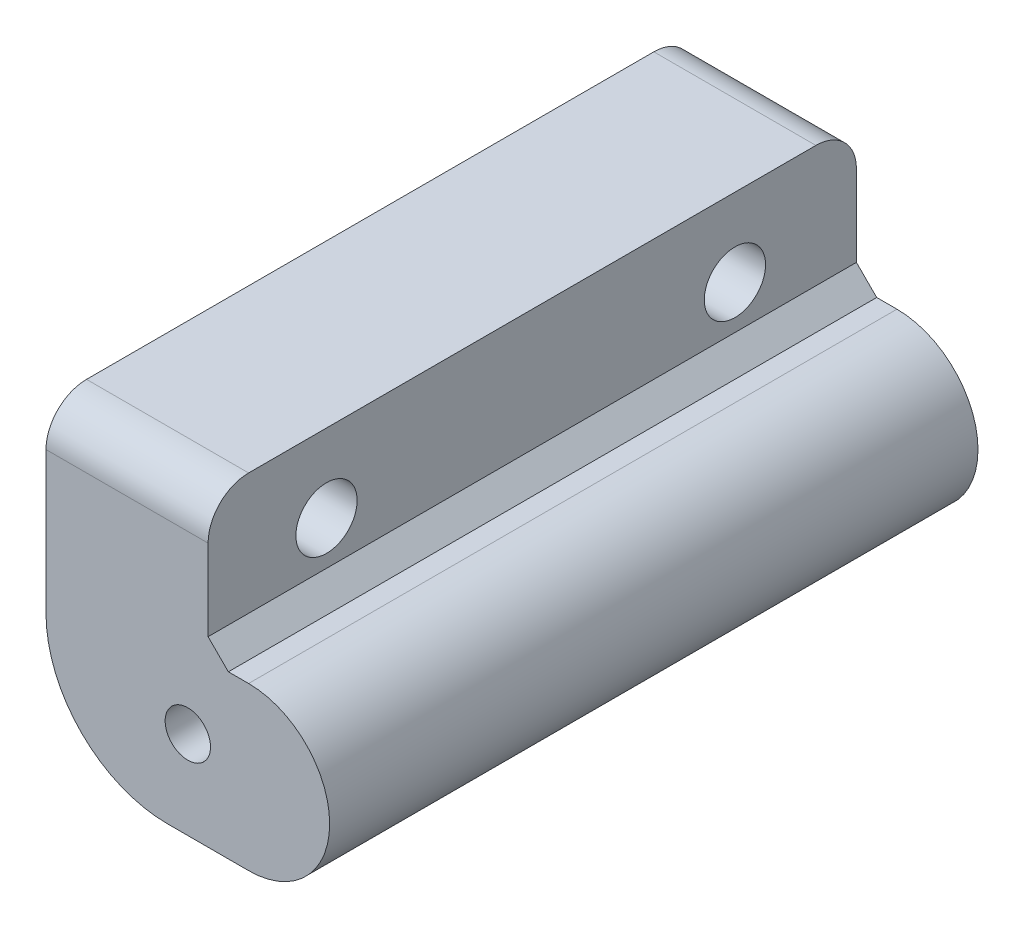
ISO-10303-21;
HEADER;
FILE_DESCRIPTION(('STEP AP214'),'2;1');
FILE_NAME('part.step','',(''),(''),'','','');
FILE_SCHEMA(('AUTOMOTIVE_DESIGN { 1 0 10303 214 1 1 1 1 }'));
ENDSEC;
DATA;
#1=APPLICATION_CONTEXT('core data for automotive mechanical design processes');
#2=APPLICATION_PROTOCOL_DEFINITION('international standard','automotive_design',2000,#1);
#3=PRODUCT_CONTEXT('',#1,'mechanical');
#4=PRODUCT('Part','Part','',(#3));
#5=PRODUCT_RELATED_PRODUCT_CATEGORY('part','',(#4));
#6=PRODUCT_DEFINITION_FORMATION('','',#4);
#7=PRODUCT_DEFINITION_CONTEXT('part definition',#1,'design');
#8=PRODUCT_DEFINITION('design','',#6,#7);
#9=PRODUCT_DEFINITION_SHAPE('','',#8);
#10=(LENGTH_UNIT() NAMED_UNIT(*) SI_UNIT(.MILLI.,.METRE.));
#11=(NAMED_UNIT(*) PLANE_ANGLE_UNIT() SI_UNIT($,.RADIAN.));
#12=(NAMED_UNIT(*) SI_UNIT($,.STERADIAN.) SOLID_ANGLE_UNIT());
#13=UNCERTAINTY_MEASURE_WITH_UNIT(LENGTH_MEASURE(1.E-05),#10,'distance_accuracy_value','');
#14=(GEOMETRIC_REPRESENTATION_CONTEXT(3) GLOBAL_UNCERTAINTY_ASSIGNED_CONTEXT((#13)) GLOBAL_UNIT_ASSIGNED_CONTEXT((#10,
#11,#12)) REPRESENTATION_CONTEXT('',''));
#15=CARTESIAN_POINT('',(0.,0.,0.));
#16=DIRECTION('',(0.,0.,1.));
#17=DIRECTION('',(1.,0.,0.));
#18=AXIS2_PLACEMENT_3D('',#15,#16,#17);
#19=CARTESIAN_POINT('',(1.5875,-3.175,0.));
#20=DIRECTION('',(0.,0.,-1.));
#21=DIRECTION('',(-1.,0.,0.));
#22=AXIS2_PLACEMENT_3D('',#19,#20,#21);
#23=CYLINDRICAL_SURFACE('',#22,3.175);
#24=DIRECTION('',(0.,0.,-1.));
#25=VECTOR('',#24,1.);
#26=CARTESIAN_POINT('',(1.5875,-6.35,25.4));
#27=LINE('',#26,#25);
#28=CARTESIAN_POINT('',(1.5875,-6.35,0.));
#29=VERTEX_POINT('',#28);
#30=CARTESIAN_POINT('',(1.5875,-6.35,25.4));
#31=VERTEX_POINT('',#30);
#32=EDGE_CURVE('E157',#29,#31,#27,.F.);
#33=ORIENTED_EDGE('',*,*,#32,.F.);
#34=CARTESIAN_POINT('',(1.5875,-3.175,0.));
#35=DIRECTION('',(0.,0.,-1.));
#36=DIRECTION('',(-1.,0.,0.));
#37=AXIS2_PLACEMENT_3D('',#34,#35,#36);
#38=CIRCLE('',#37,3.175);
#39=CARTESIAN_POINT('',(1.5875,0.,0.));
#40=VERTEX_POINT('',#39);
#41=EDGE_CURVE('E163',#40,#29,#38,.T.);
#42=ORIENTED_EDGE('',*,*,#41,.F.);
#43=DIRECTION('',(0.,0.,-1.));
#44=VECTOR('',#43,1.);
#45=CARTESIAN_POINT('',(1.5875,0.,25.4));
#46=LINE('',#45,#44);
#47=CARTESIAN_POINT('',(1.5875,0.,25.4));
#48=VERTEX_POINT('',#47);
#49=EDGE_CURVE('E160',#48,#40,#46,.T.);
#50=ORIENTED_EDGE('',*,*,#49,.F.);
#51=CARTESIAN_POINT('',(1.5875,-3.175,25.4));
#52=DIRECTION('',(0.,0.,-1.));
#53=DIRECTION('',(-1.,0.,0.));
#54=AXIS2_PLACEMENT_3D('',#51,#52,#53);
#55=CIRCLE('',#54,3.175);
#56=EDGE_CURVE('E166',#31,#48,#55,.F.);
#57=ORIENTED_EDGE('',*,*,#56,.F.);
#58=EDGE_LOOP('',(#33,#42,#50,#57));
#59=FACE_BOUND('',#58,.T.);
#60=ADVANCED_FACE('F38',(#59),#23,.T.);
#61=CARTESIAN_POINT('',(0.,0.,25.4));
#62=DIRECTION('',(-1.,0.,0.));
#63=DIRECTION('',(0.,0.,1.));
#64=AXIS2_PLACEMENT_3D('',#61,#62,#63);
#65=PLANE('',#64);
#66=CARTESIAN_POINT('',(0.,2.49999999999956,4.76093750000008));
#67=DIRECTION('',(1.,0.,0.));
#68=DIRECTION('',(0.,0.,-1.));
#69=AXIS2_PLACEMENT_3D('',#66,#67,#68);
#70=CIRCLE('',#69,1.19999999999999);
#71=CARTESIAN_POINT('',(0.,2.49999999999956,3.56093750000009));
#72=VERTEX_POINT('',#71);
#73=EDGE_CURVE('E219',#72,#72,#70,.T.);
#74=ORIENTED_EDGE('',*,*,#73,.F.);
#75=EDGE_LOOP('',(#74));
#76=FACE_BOUND('',#75,.T.);
#77=DIRECTION('',(0.,1.,0.));
#78=VECTOR('',#77,1.);
#79=CARTESIAN_POINT('',(0.,0.,0.));
#80=LINE('',#79,#78);
#81=CARTESIAN_POINT('',(0.,0.793749999999996,0.));
#82=VERTEX_POINT('',#81);
#83=CARTESIAN_POINT('',(0.,3.96875,0.));
#84=VERTEX_POINT('',#83);
#85=EDGE_CURVE('E132',#82,#84,#80,.T.);
#86=ORIENTED_EDGE('',*,*,#85,.T.);
#87=CARTESIAN_POINT('',(0.,3.96875,1.5875));
#88=DIRECTION('',(-1.,0.,0.));
#89=DIRECTION('',(0.,0.,1.));
#90=AXIS2_PLACEMENT_3D('',#87,#88,#89);
#91=CIRCLE('',#90,1.5875);
#92=CARTESIAN_POINT('',(0.,5.55625,1.5875));
#93=VERTEX_POINT('',#92);
#94=EDGE_CURVE('E46',#84,#93,#91,.F.);
#95=ORIENTED_EDGE('',*,*,#94,.T.);
#96=DIRECTION('',(0.,0.,-1.));
#97=VECTOR('',#96,1.);
#98=CARTESIAN_POINT('',(0.,5.55625,25.4));
#99=LINE('',#98,#97);
#100=CARTESIAN_POINT('',(0.,5.55625,23.8125));
#101=VERTEX_POINT('',#100);
#102=EDGE_CURVE('E135',#101,#93,#99,.T.);
#103=ORIENTED_EDGE('',*,*,#102,.F.);
#104=CARTESIAN_POINT('',(0.,3.96875,23.8125));
#105=DIRECTION('',(-1.,0.,0.));
#106=DIRECTION('',(0.,0.,1.));
#107=AXIS2_PLACEMENT_3D('',#104,#105,#106);
#108=CIRCLE('',#107,1.5875);
#109=CARTESIAN_POINT('',(0.,3.96875,25.4));
#110=VERTEX_POINT('',#109);
#111=EDGE_CURVE('E53',#101,#110,#108,.F.);
#112=ORIENTED_EDGE('',*,*,#111,.T.);
#113=DIRECTION('',(0.,1.,0.));
#114=VECTOR('',#113,1.);
#115=CARTESIAN_POINT('',(0.,0.,25.4));
#116=LINE('',#115,#114);
#117=CARTESIAN_POINT('',(0.,0.793749999999996,25.4));
#118=VERTEX_POINT('',#117);
#119=EDGE_CURVE('E134',#118,#110,#116,.T.);
#120=ORIENTED_EDGE('',*,*,#119,.F.);
#121=DIRECTION('',(0.,0.,-1.));
#122=VECTOR('',#121,1.);
#123=CARTESIAN_POINT('',(0.,0.793749999999996,0.));
#124=LINE('',#123,#122);
#125=EDGE_CURVE('E124',#118,#82,#124,.T.);
#126=ORIENTED_EDGE('',*,*,#125,.T.);
#127=EDGE_LOOP('',(#86,#95,#103,#112,#120,#126));
#128=FACE_BOUND('',#127,.T.);
#129=CARTESIAN_POINT('',(0.,2.49999999999963,20.7609375000001));
#130=DIRECTION('',(1.,0.,0.));
#131=DIRECTION('',(0.,0.,-1.));
#132=AXIS2_PLACEMENT_3D('',#129,#130,#131);
#133=CIRCLE('',#132,1.19999999999999);
#134=CARTESIAN_POINT('',(0.,2.49999999999963,19.5609375000001));
#135=VERTEX_POINT('',#134);
#136=EDGE_CURVE('E225',#135,#135,#133,.T.);
#137=ORIENTED_EDGE('',*,*,#136,.F.);
#138=EDGE_LOOP('',(#137));
#139=FACE_BOUND('',#138,.T.);
#140=ADVANCED_FACE('F130',(#76,#128,#139),#65,.F.);
#141=CARTESIAN_POINT('',(4.7625,0.,25.4));
#142=DIRECTION('',(0.,-1.,0.));
#143=DIRECTION('',(1.,0.,0.));
#144=AXIS2_PLACEMENT_3D('',#141,#142,#143);
#145=PLANE('',#144);
#146=DIRECTION('',(-1.,0.,0.));
#147=VECTOR('',#146,1.);
#148=CARTESIAN_POINT('',(4.7625,0.,25.4));
#149=LINE('',#148,#147);
#150=CARTESIAN_POINT('',(0.793749999999991,0.,25.4));
#151=VERTEX_POINT('',#150);
#152=EDGE_CURVE('E148',#48,#151,#149,.T.);
#153=ORIENTED_EDGE('',*,*,#152,.F.);
#154=ORIENTED_EDGE('',*,*,#49,.T.);
#155=DIRECTION('',(-1.,0.,0.));
#156=VECTOR('',#155,1.);
#157=CARTESIAN_POINT('',(4.7625,0.,0.));
#158=LINE('',#157,#156);
#159=CARTESIAN_POINT('',(0.793749999999991,0.,0.));
#160=VERTEX_POINT('',#159);
#161=EDGE_CURVE('E139',#40,#160,#158,.T.);
#162=ORIENTED_EDGE('',*,*,#161,.T.);
#163=DIRECTION('',(0.,0.,1.));
#164=VECTOR('',#163,1.);
#165=CARTESIAN_POINT('',(0.793749999999989,0.,25.4));
#166=LINE('',#165,#164);
#167=EDGE_CURVE('E126',#160,#151,#166,.T.);
#168=ORIENTED_EDGE('',*,*,#167,.T.);
#169=EDGE_LOOP('',(#153,#154,#162,#168));
#170=FACE_BOUND('',#169,.T.);
#171=ADVANCED_FACE('F231',(#170),#145,.F.);
#172=CARTESIAN_POINT('',(0.,5.55625,25.4));
#173=DIRECTION('',(0.,-1.,0.));
#174=DIRECTION('',(1.,0.,0.));
#175=AXIS2_PLACEMENT_3D('',#172,#173,#174);
#176=PLANE('',#175);
#177=ORIENTED_EDGE('',*,*,#102,.T.);
#178=DIRECTION('',(-1.,0.,0.));
#179=VECTOR('',#178,1.);
#180=CARTESIAN_POINT('',(-6.35,5.55625,1.5875));
#181=LINE('',#180,#179);
#182=CARTESIAN_POINT('',(-6.35,5.55625,1.5875));
#183=VERTEX_POINT('',#182);
#184=EDGE_CURVE('E181',#93,#183,#181,.T.);
#185=ORIENTED_EDGE('',*,*,#184,.T.);
#186=DIRECTION('',(0.,0.,-1.));
#187=VECTOR('',#186,1.);
#188=CARTESIAN_POINT('',(-6.35,5.55625,25.4));
#189=LINE('',#188,#187);
#190=CARTESIAN_POINT('',(-6.35,5.55625,23.8125));
#191=VERTEX_POINT('',#190);
#192=EDGE_CURVE('E149',#191,#183,#189,.T.);
#193=ORIENTED_EDGE('',*,*,#192,.F.);
#194=DIRECTION('',(-1.,0.,0.));
#195=VECTOR('',#194,1.);
#196=CARTESIAN_POINT('',(0.,5.55625,23.8125));
#197=LINE('',#196,#195);
#198=EDGE_CURVE('E179',#191,#101,#197,.F.);
#199=ORIENTED_EDGE('',*,*,#198,.T.);
#200=EDGE_LOOP('',(#177,#185,#193,#199));
#201=FACE_BOUND('',#200,.T.);
#202=ADVANCED_FACE('F192',(#201),#176,.F.);
#203=CARTESIAN_POINT('',(-6.35,5.55625,25.4));
#204=DIRECTION('',(1.,0.,0.));
#205=DIRECTION('',(0.,1.,0.));
#206=AXIS2_PLACEMENT_3D('',#203,#204,#205);
#207=PLANE('',#206);
#208=CARTESIAN_POINT('',(-6.35,2.49999999999963,20.7609375000001));
#209=DIRECTION('',(1.,0.,0.));
#210=DIRECTION('',(0.,1.,0.));
#211=AXIS2_PLACEMENT_3D('',#208,#209,#210);
#212=CIRCLE('',#211,1.19999999999999);
#213=CARTESIAN_POINT('',(-6.35,3.69999999999962,20.7609375000001));
#214=VERTEX_POINT('',#213);
#215=EDGE_CURVE('E222',#214,#214,#212,.T.);
#216=ORIENTED_EDGE('',*,*,#215,.T.);
#217=EDGE_LOOP('',(#216));
#218=FACE_BOUND('',#217,.T.);
#219=CARTESIAN_POINT('',(-6.35,2.49999999999956,4.76093750000008));
#220=DIRECTION('',(1.,0.,0.));
#221=DIRECTION('',(0.,1.,0.));
#222=AXIS2_PLACEMENT_3D('',#219,#220,#221);
#223=CIRCLE('',#222,1.19999999999999);
#224=CARTESIAN_POINT('',(-6.35,3.69999999999955,4.76093750000008));
#225=VERTEX_POINT('',#224);
#226=EDGE_CURVE('E214',#225,#225,#223,.T.);
#227=ORIENTED_EDGE('',*,*,#226,.T.);
#228=EDGE_LOOP('',(#227));
#229=FACE_BOUND('',#228,.T.);
#230=ORIENTED_EDGE('',*,*,#192,.T.);
#231=CARTESIAN_POINT('',(-6.35,3.96875,1.5875));
#232=DIRECTION('',(1.,0.,0.));
#233=DIRECTION('',(0.,1.,0.));
#234=AXIS2_PLACEMENT_3D('',#231,#232,#233);
#235=CIRCLE('',#234,1.5875);
#236=CARTESIAN_POINT('',(-6.35,3.96875,0.));
#237=VERTEX_POINT('',#236);
#238=EDGE_CURVE('E186',#183,#237,#235,.F.);
#239=ORIENTED_EDGE('',*,*,#238,.T.);
#240=DIRECTION('',(0.,-1.,0.));
#241=VECTOR('',#240,1.);
#242=CARTESIAN_POINT('',(-6.35,5.55625,0.));
#243=LINE('',#242,#241);
#244=CARTESIAN_POINT('',(-6.35,-1.5875,0.));
#245=VERTEX_POINT('',#244);
#246=EDGE_CURVE('E138',#237,#245,#243,.T.);
#247=ORIENTED_EDGE('',*,*,#246,.T.);
#248=DIRECTION('',(0.,0.,-1.));
#249=VECTOR('',#248,1.);
#250=CARTESIAN_POINT('',(-6.35,-1.5875,25.4));
#251=LINE('',#250,#249);
#252=CARTESIAN_POINT('',(-6.35,-1.5875,25.4));
#253=VERTEX_POINT('',#252);
#254=EDGE_CURVE('E174',#245,#253,#251,.F.);
#255=ORIENTED_EDGE('',*,*,#254,.T.);
#256=DIRECTION('',(0.,-1.,0.));
#257=VECTOR('',#256,1.);
#258=CARTESIAN_POINT('',(-6.35,5.55625,25.4));
#259=LINE('',#258,#257);
#260=CARTESIAN_POINT('',(-6.35,3.96875,25.4));
#261=VERTEX_POINT('',#260);
#262=EDGE_CURVE('E205',#261,#253,#259,.T.);
#263=ORIENTED_EDGE('',*,*,#262,.F.);
#264=CARTESIAN_POINT('',(-6.35,3.96875,23.8125));
#265=DIRECTION('',(1.,0.,0.));
#266=DIRECTION('',(0.,1.,0.));
#267=AXIS2_PLACEMENT_3D('',#264,#265,#266);
#268=CIRCLE('',#267,1.5875);
#269=EDGE_CURVE('E184',#261,#191,#268,.F.);
#270=ORIENTED_EDGE('',*,*,#269,.T.);
#271=EDGE_LOOP('',(#230,#239,#247,#255,#263,#270));
#272=FACE_BOUND('',#271,.T.);
#273=ADVANCED_FACE('F197',(#218,#229,#272),#207,.F.);
#274=CARTESIAN_POINT('',(-6.35,-6.35,25.4));
#275=DIRECTION('',(0.,1.,0.));
#276=DIRECTION('',(0.,0.,1.));
#277=AXIS2_PLACEMENT_3D('',#274,#275,#276);
#278=PLANE('',#277);
#279=DIRECTION('',(1.,0.,0.));
#280=VECTOR('',#279,1.);
#281=CARTESIAN_POINT('',(-6.35,-6.35,25.4));
#282=LINE('',#281,#280);
#283=CARTESIAN_POINT('',(-1.5875,-6.35,25.4));
#284=VERTEX_POINT('',#283);
#285=EDGE_CURVE('E152',#284,#31,#282,.T.);
#286=ORIENTED_EDGE('',*,*,#285,.F.);
#287=DIRECTION('',(0.,0.,-1.));
#288=VECTOR('',#287,1.);
#289=CARTESIAN_POINT('',(-1.5875,-6.35,25.4));
#290=LINE('',#289,#288);
#291=CARTESIAN_POINT('',(-1.5875,-6.35,0.));
#292=VERTEX_POINT('',#291);
#293=EDGE_CURVE('E168',#284,#292,#290,.T.);
#294=ORIENTED_EDGE('',*,*,#293,.T.);
#295=DIRECTION('',(1.,0.,0.));
#296=VECTOR('',#295,1.);
#297=CARTESIAN_POINT('',(-6.35,-6.35,0.));
#298=LINE('',#297,#296);
#299=EDGE_CURVE('E141',#292,#29,#298,.T.);
#300=ORIENTED_EDGE('',*,*,#299,.T.);
#301=ORIENTED_EDGE('',*,*,#32,.T.);
#302=EDGE_LOOP('',(#286,#294,#300,#301));
#303=FACE_BOUND('',#302,.T.);
#304=ADVANCED_FACE('F268',(#303),#278,.F.);
#305=CARTESIAN_POINT('',(0.,0.,25.4));
#306=DIRECTION('',(0.,0.,-1.));
#307=DIRECTION('',(-1.,0.,0.));
#308=AXIS2_PLACEMENT_3D('',#305,#306,#307);
#309=PLANE('',#308);
#310=CARTESIAN_POINT('',(-0.79375,-2.90315000000251,25.4));
#311=DIRECTION('',(0.,0.,1.));
#312=DIRECTION('',(1.,0.,0.));
#313=AXIS2_PLACEMENT_3D('',#310,#311,#312);
#314=CIRCLE('',#313,0.889);
#315=CARTESIAN_POINT('',(0.0952500000000001,-2.90315000000251,25.4));
#316=VERTEX_POINT('',#315);
#317=EDGE_CURVE('E211',#316,#316,#314,.T.);
#318=ORIENTED_EDGE('',*,*,#317,.F.);
#319=EDGE_LOOP('',(#318));
#320=FACE_BOUND('',#319,.T.);
#321=ORIENTED_EDGE('',*,*,#119,.T.);
#322=DIRECTION('',(-1.,0.,0.));
#323=VECTOR('',#322,1.);
#324=CARTESIAN_POINT('',(0.,3.96875,25.4));
#325=LINE('',#324,#323);
#326=EDGE_CURVE('E11',#110,#261,#325,.T.);
#327=ORIENTED_EDGE('',*,*,#326,.T.);
#328=ORIENTED_EDGE('',*,*,#262,.T.);
#329=CARTESIAN_POINT('',(-1.5875,-1.5875,25.4));
#330=DIRECTION('',(0.,0.,-1.));
#331=DIRECTION('',(-1.,0.,0.));
#332=AXIS2_PLACEMENT_3D('',#329,#330,#331);
#333=CIRCLE('',#332,4.7625);
#334=EDGE_CURVE('E177',#253,#284,#333,.F.);
#335=ORIENTED_EDGE('',*,*,#334,.T.);
#336=ORIENTED_EDGE('',*,*,#285,.T.);
#337=ORIENTED_EDGE('',*,*,#56,.T.);
#338=ORIENTED_EDGE('',*,*,#152,.T.);
#339=DIRECTION('',(0.707106781186544,-0.707106781186551,0.));
#340=VECTOR('',#339,1.);
#341=CARTESIAN_POINT('',(0.396874999999998,0.396874999999994,25.4));
#342=LINE('',#341,#340);
#343=EDGE_CURVE('E128',#151,#118,#342,.F.);
#344=ORIENTED_EDGE('',*,*,#343,.T.);
#345=EDGE_LOOP('',(#321,#327,#328,#335,#336,#337,#338,#344));
#346=FACE_BOUND('',#345,.T.);
#347=ADVANCED_FACE('F261',(#320,#346),#309,.F.);
#348=CARTESIAN_POINT('',(0.,0.,0.));
#349=DIRECTION('',(0.,0.,-1.));
#350=DIRECTION('',(-1.,0.,0.));
#351=AXIS2_PLACEMENT_3D('',#348,#349,#350);
#352=PLANE('',#351);
#353=CARTESIAN_POINT('',(-0.79375,-2.90315000000251,0.));
#354=DIRECTION('',(0.,0.,1.));
#355=DIRECTION('',(1.,0.,0.));
#356=AXIS2_PLACEMENT_3D('',#353,#354,#355);
#357=CIRCLE('',#356,0.889);
#358=CARTESIAN_POINT('',(0.0952500000000001,-2.90315000000251,0.));
#359=VERTEX_POINT('',#358);
#360=EDGE_CURVE('E143',#359,#359,#357,.T.);
#361=ORIENTED_EDGE('',*,*,#360,.T.);
#362=EDGE_LOOP('',(#361));
#363=FACE_BOUND('',#362,.T.);
#364=ORIENTED_EDGE('',*,*,#246,.F.);
#365=DIRECTION('',(-1.,0.,0.));
#366=VECTOR('',#365,1.);
#367=CARTESIAN_POINT('',(0.,3.96875,0.));
#368=LINE('',#367,#366);
#369=EDGE_CURVE('E61',#237,#84,#368,.F.);
#370=ORIENTED_EDGE('',*,*,#369,.T.);
#371=ORIENTED_EDGE('',*,*,#85,.F.);
#372=DIRECTION('',(-0.707106781186544,0.707106781186551,0.));
#373=VECTOR('',#372,1.);
#374=CARTESIAN_POINT('',(0.,0.793749999999996,0.));
#375=LINE('',#374,#373);
#376=EDGE_CURVE('E120',#82,#160,#375,.F.);
#377=ORIENTED_EDGE('',*,*,#376,.T.);
#378=ORIENTED_EDGE('',*,*,#161,.F.);
#379=ORIENTED_EDGE('',*,*,#41,.T.);
#380=ORIENTED_EDGE('',*,*,#299,.F.);
#381=CARTESIAN_POINT('',(-1.5875,-1.5875,0.));
#382=DIRECTION('',(0.,0.,-1.));
#383=DIRECTION('',(-1.,0.,0.));
#384=AXIS2_PLACEMENT_3D('',#381,#382,#383);
#385=CIRCLE('',#384,4.7625);
#386=EDGE_CURVE('E171',#292,#245,#385,.T.);
#387=ORIENTED_EDGE('',*,*,#386,.T.);
#388=EDGE_LOOP('',(#364,#370,#371,#377,#378,#379,#380,#387));
#389=FACE_BOUND('',#388,.T.);
#390=ADVANCED_FACE('F137',(#363,#389),#352,.T.);
#391=CARTESIAN_POINT('',(0.,0.793749999999996,25.4));
#392=DIRECTION('',(0.707106781186551,0.707106781186544,0.));
#393=DIRECTION('',(0.,0.,1.));
#394=AXIS2_PLACEMENT_3D('',#391,#392,#393);
#395=PLANE('',#394);
#396=ORIENTED_EDGE('',*,*,#343,.F.);
#397=ORIENTED_EDGE('',*,*,#167,.F.);
#398=ORIENTED_EDGE('',*,*,#376,.F.);
#399=ORIENTED_EDGE('',*,*,#125,.F.);
#400=EDGE_LOOP('',(#396,#397,#398,#399));
#401=FACE_BOUND('',#400,.T.);
#402=ADVANCED_FACE('F123',(#401),#395,.T.);
#403=CARTESIAN_POINT('',(-0.79375,-2.90315000000251,0.));
#404=DIRECTION('',(0.,0.,1.));
#405=DIRECTION('',(1.,0.,0.));
#406=AXIS2_PLACEMENT_3D('',#403,#404,#405);
#407=CYLINDRICAL_SURFACE('',#406,0.889);
#408=ORIENTED_EDGE('',*,*,#360,.F.);
#409=EDGE_LOOP('',(#408));
#410=FACE_BOUND('',#409,.T.);
#411=ORIENTED_EDGE('',*,*,#317,.T.);
#412=EDGE_LOOP('',(#411));
#413=FACE_BOUND('',#412,.T.);
#414=ADVANCED_FACE('F247',(#410,#413),#407,.F.);
#415=CARTESIAN_POINT('',(0.,2.49999999999956,4.76093750000008));
#416=DIRECTION('',(1.,0.,0.));
#417=DIRECTION('',(0.,0.,-1.));
#418=AXIS2_PLACEMENT_3D('',#415,#416,#417);
#419=CYLINDRICAL_SURFACE('',#418,1.19999999999999);
#420=ORIENTED_EDGE('',*,*,#226,.F.);
#421=EDGE_LOOP('',(#420));
#422=FACE_BOUND('',#421,.T.);
#423=ORIENTED_EDGE('',*,*,#73,.T.);
#424=EDGE_LOOP('',(#423));
#425=FACE_BOUND('',#424,.T.);
#426=ADVANCED_FACE('F284',(#422,#425),#419,.F.);
#427=CARTESIAN_POINT('',(0.,2.49999999999963,20.7609375000001));
#428=DIRECTION('',(1.,0.,0.));
#429=DIRECTION('',(0.,0.,-1.));
#430=AXIS2_PLACEMENT_3D('',#427,#428,#429);
#431=CYLINDRICAL_SURFACE('',#430,1.19999999999999);
#432=ORIENTED_EDGE('',*,*,#215,.F.);
#433=EDGE_LOOP('',(#432));
#434=FACE_BOUND('',#433,.T.);
#435=ORIENTED_EDGE('',*,*,#136,.T.);
#436=EDGE_LOOP('',(#435));
#437=FACE_BOUND('',#436,.T.);
#438=ADVANCED_FACE('F229',(#434,#437),#431,.F.);
#439=CARTESIAN_POINT('',(-1.5875,-1.5875,25.4));
#440=DIRECTION('',(0.,0.,-1.));
#441=DIRECTION('',(-1.,0.,0.));
#442=AXIS2_PLACEMENT_3D('',#439,#440,#441);
#443=CYLINDRICAL_SURFACE('',#442,4.7625);
#444=ORIENTED_EDGE('',*,*,#334,.F.);
#445=ORIENTED_EDGE('',*,*,#254,.F.);
#446=ORIENTED_EDGE('',*,*,#386,.F.);
#447=ORIENTED_EDGE('',*,*,#293,.F.);
#448=EDGE_LOOP('',(#444,#445,#446,#447));
#449=FACE_BOUND('',#448,.T.);
#450=ADVANCED_FACE('F203',(#449),#443,.T.);
#451=CARTESIAN_POINT('',(0.,3.96875,1.5875));
#452=DIRECTION('',(1.,0.,0.));
#453=DIRECTION('',(0.,1.,0.));
#454=AXIS2_PLACEMENT_3D('',#451,#452,#453);
#455=CYLINDRICAL_SURFACE('',#454,1.5875);
#456=ORIENTED_EDGE('',*,*,#94,.F.);
#457=ORIENTED_EDGE('',*,*,#369,.F.);
#458=ORIENTED_EDGE('',*,*,#238,.F.);
#459=ORIENTED_EDGE('',*,*,#184,.F.);
#460=EDGE_LOOP('',(#456,#457,#458,#459));
#461=FACE_BOUND('',#460,.T.);
#462=ADVANCED_FACE('F195',(#461),#455,.T.);
#463=CARTESIAN_POINT('',(0.,3.96875,23.8125));
#464=DIRECTION('',(-1.,0.,0.));
#465=DIRECTION('',(0.,-1.,0.));
#466=AXIS2_PLACEMENT_3D('',#463,#464,#465);
#467=CYLINDRICAL_SURFACE('',#466,1.5875);
#468=ORIENTED_EDGE('',*,*,#111,.F.);
#469=ORIENTED_EDGE('',*,*,#198,.F.);
#470=ORIENTED_EDGE('',*,*,#269,.F.);
#471=ORIENTED_EDGE('',*,*,#326,.F.);
#472=EDGE_LOOP('',(#468,#469,#470,#471));
#473=FACE_BOUND('',#472,.T.);
#474=ADVANCED_FACE('F40',(#473),#467,.T.);
#475=CLOSED_SHELL('',(#60,#140,#171,#202,#273,#304,#347,#390,#402,#414,#426,#438,#450,#462,#474));
#476=MANIFOLD_SOLID_BREP('B2',#475);
#477=ADVANCED_BREP_SHAPE_REPRESENTATION('',(#18,#476),#14);
#478=SHAPE_DEFINITION_REPRESENTATION(#9,#477);
ENDSEC;
END-ISO-10303-21;
